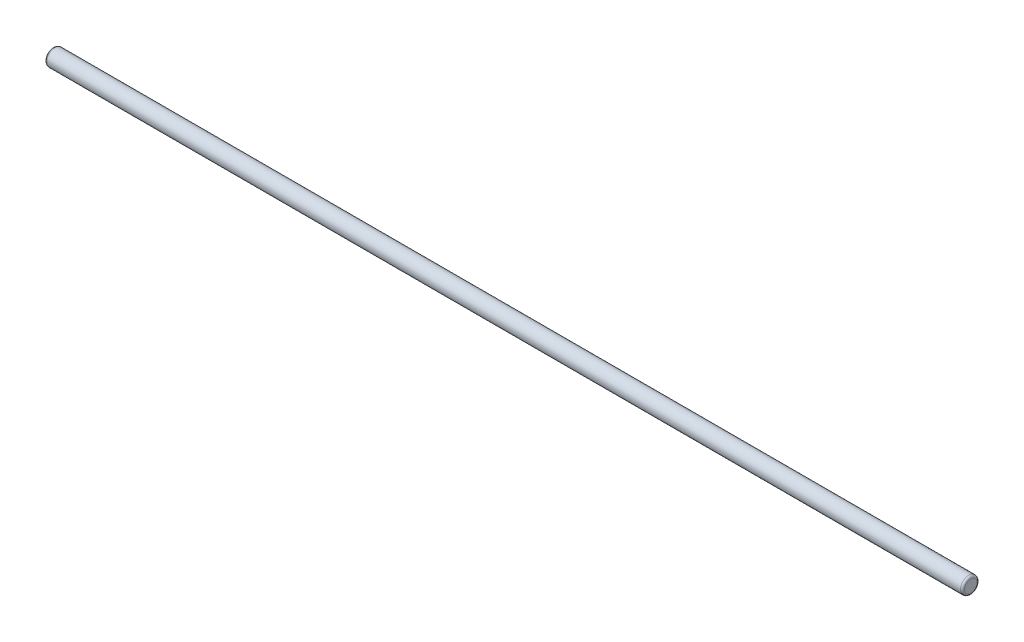
ISO-10303-21;
HEADER;
FILE_DESCRIPTION(('STEP AP214'),'2;1');
FILE_NAME('part.step','',(''),(''),'','','');
FILE_SCHEMA(('AUTOMOTIVE_DESIGN { 1 0 10303 214 1 1 1 1 }'));
ENDSEC;
DATA;
#1=APPLICATION_CONTEXT('core data for automotive mechanical design processes');
#2=APPLICATION_PROTOCOL_DEFINITION('international standard','automotive_design',2000,#1);
#3=PRODUCT_CONTEXT('',#1,'mechanical');
#4=PRODUCT('Part','Part','',(#3));
#5=PRODUCT_RELATED_PRODUCT_CATEGORY('part','',(#4));
#6=PRODUCT_DEFINITION_FORMATION('','',#4);
#7=PRODUCT_DEFINITION_CONTEXT('part definition',#1,'design');
#8=PRODUCT_DEFINITION('design','',#6,#7);
#9=PRODUCT_DEFINITION_SHAPE('','',#8);
#10=(LENGTH_UNIT() NAMED_UNIT(*) SI_UNIT(.MILLI.,.METRE.));
#11=(NAMED_UNIT(*) PLANE_ANGLE_UNIT() SI_UNIT($,.RADIAN.));
#12=(NAMED_UNIT(*) SI_UNIT($,.STERADIAN.) SOLID_ANGLE_UNIT());
#13=UNCERTAINTY_MEASURE_WITH_UNIT(LENGTH_MEASURE(1.E-05),#10,'distance_accuracy_value','');
#14=(GEOMETRIC_REPRESENTATION_CONTEXT(3) GLOBAL_UNCERTAINTY_ASSIGNED_CONTEXT((#13)) GLOBAL_UNIT_ASSIGNED_CONTEXT((#10,
#11,#12)) REPRESENTATION_CONTEXT('',''));
#15=CARTESIAN_POINT('',(0.,0.,0.));
#16=DIRECTION('',(0.,0.,1.));
#17=DIRECTION('',(1.,0.,0.));
#18=AXIS2_PLACEMENT_3D('',#15,#16,#17);
#19=CARTESIAN_POINT('',(440.,0.,0.));
#20=DIRECTION('',(-1.,0.,0.));
#21=DIRECTION('',(0.,0.,1.));
#22=AXIS2_PLACEMENT_3D('',#19,#20,#21);
#23=CYLINDRICAL_SURFACE('',#22,4.);
#24=CARTESIAN_POINT('',(1.,0.,0.));
#25=DIRECTION('',(1.,0.,0.));
#26=DIRECTION('',(0.,0.,-1.));
#27=AXIS2_PLACEMENT_3D('',#24,#25,#26);
#28=CIRCLE('',#27,4.);
#29=CARTESIAN_POINT('',(1.,0.,-4.));
#30=VERTEX_POINT('',#29);
#31=EDGE_CURVE('E50',#30,#30,#28,.T.);
#32=ORIENTED_EDGE('',*,*,#31,.T.);
#33=EDGE_LOOP('',(#32));
#34=FACE_BOUND('',#33,.T.);
#35=CARTESIAN_POINT('',(439.,0.,0.));
#36=DIRECTION('',(1.,0.,0.));
#37=DIRECTION('',(0.,0.,-1.));
#38=AXIS2_PLACEMENT_3D('',#35,#36,#37);
#39=CIRCLE('',#38,4.);
#40=CARTESIAN_POINT('',(439.,0.,-4.));
#41=VERTEX_POINT('',#40);
#42=EDGE_CURVE('E54',#41,#41,#39,.F.);
#43=ORIENTED_EDGE('',*,*,#42,.T.);
#44=EDGE_LOOP('',(#43));
#45=FACE_BOUND('',#44,.T.);
#46=ADVANCED_FACE('F39',(#34,#45),#23,.T.);
#47=CARTESIAN_POINT('',(440.,0.,0.));
#48=DIRECTION('',(1.,0.,0.));
#49=DIRECTION('',(0.,0.,-1.));
#50=AXIS2_PLACEMENT_3D('',#47,#48,#49);
#51=PLANE('',#50);
#52=CARTESIAN_POINT('',(440.,0.,0.));
#53=DIRECTION('',(1.,0.,0.));
#54=DIRECTION('',(0.,0.,-1.));
#55=AXIS2_PLACEMENT_3D('',#52,#53,#54);
#56=CIRCLE('',#55,3.);
#57=CARTESIAN_POINT('',(440.,0.,-3.));
#58=VERTEX_POINT('',#57);
#59=EDGE_CURVE('E10',#58,#58,#56,.T.);
#60=ORIENTED_EDGE('',*,*,#59,.T.);
#61=EDGE_LOOP('',(#60));
#62=FACE_BOUND('',#61,.T.);
#63=ADVANCED_FACE('F70',(#62),#51,.T.);
#64=CARTESIAN_POINT('',(0.,0.,0.));
#65=DIRECTION('',(1.,0.,0.));
#66=DIRECTION('',(0.,0.,-1.));
#67=AXIS2_PLACEMENT_3D('',#64,#65,#66);
#68=PLANE('',#67);
#69=CARTESIAN_POINT('',(0.,0.,0.));
#70=DIRECTION('',(1.,0.,0.));
#71=DIRECTION('',(0.,0.,-1.));
#72=AXIS2_PLACEMENT_3D('',#69,#70,#71);
#73=CIRCLE('',#72,3.);
#74=CARTESIAN_POINT('',(0.,0.,-3.));
#75=VERTEX_POINT('',#74);
#76=EDGE_CURVE('E46',#75,#75,#73,.F.);
#77=ORIENTED_EDGE('',*,*,#76,.T.);
#78=EDGE_LOOP('',(#77));
#79=FACE_BOUND('',#78,.T.);
#80=ADVANCED_FACE('F67',(#79),#68,.F.);
#81=CARTESIAN_POINT('',(1.,0.,0.));
#82=DIRECTION('',(1.,0.,0.));
#83=DIRECTION('',(0.,0.,-1.));
#84=AXIS2_PLACEMENT_3D('',#81,#82,#83);
#85=TOROIDAL_SURFACE('',#84,3.,1.);
#86=ORIENTED_EDGE('',*,*,#76,.F.);
#87=EDGE_LOOP('',(#86));
#88=FACE_BOUND('',#87,.T.);
#89=ORIENTED_EDGE('',*,*,#31,.F.);
#90=EDGE_LOOP('',(#89));
#91=FACE_BOUND('',#90,.T.);
#92=ADVANCED_FACE('F63',(#88,#91),#85,.T.);
#93=CARTESIAN_POINT('',(439.,0.,0.));
#94=DIRECTION('',(1.,0.,0.));
#95=DIRECTION('',(0.,0.,-1.));
#96=AXIS2_PLACEMENT_3D('',#93,#94,#95);
#97=TOROIDAL_SURFACE('',#96,3.,1.);
#98=ORIENTED_EDGE('',*,*,#42,.F.);
#99=EDGE_LOOP('',(#98));
#100=FACE_BOUND('',#99,.T.);
#101=ORIENTED_EDGE('',*,*,#59,.F.);
#102=EDGE_LOOP('',(#101));
#103=FACE_BOUND('',#102,.T.);
#104=ADVANCED_FACE('F41',(#100,#103),#97,.T.);
#105=CLOSED_SHELL('',(#46,#63,#80,#92,#104));
#106=MANIFOLD_SOLID_BREP('B2',#105);
#107=ADVANCED_BREP_SHAPE_REPRESENTATION('',(#18,#106),#14);
#108=SHAPE_DEFINITION_REPRESENTATION(#9,#107);
ENDSEC;
END-ISO-10303-21;
